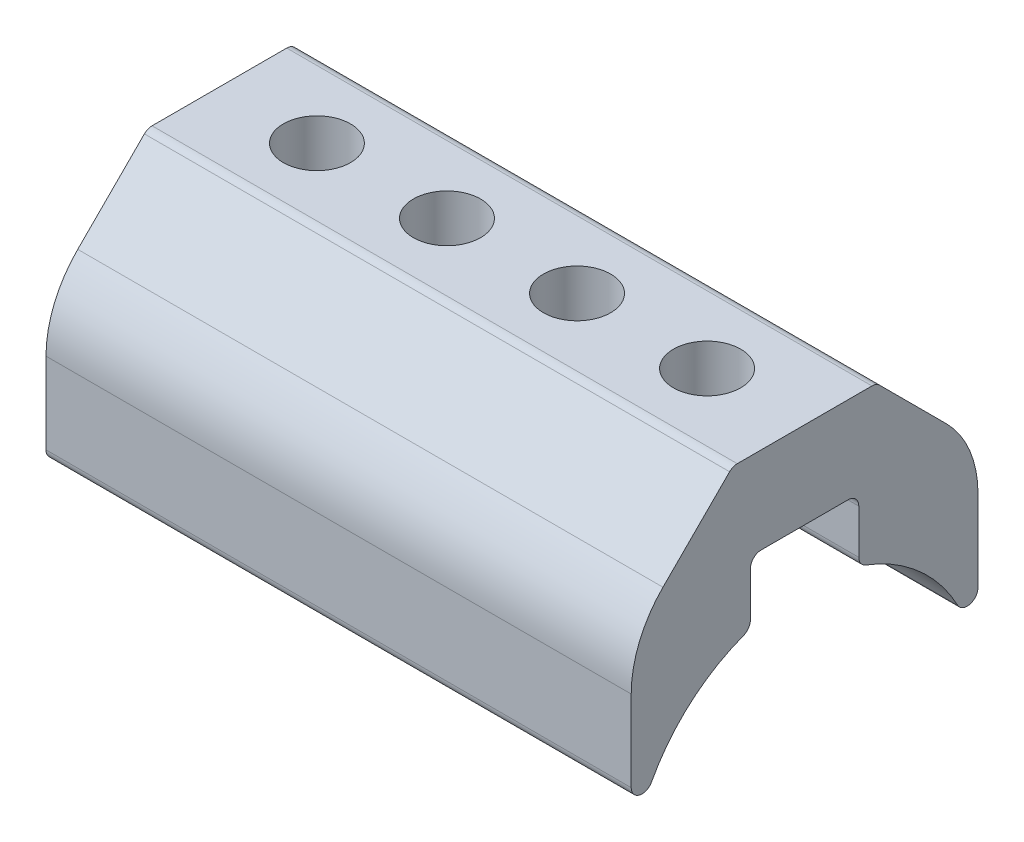
ISO-10303-21;
HEADER;
FILE_DESCRIPTION(('STEP AP214'),'2;1');
FILE_NAME('part.step','',(''),(''),'','','');
FILE_SCHEMA(('AUTOMOTIVE_DESIGN { 1 0 10303 214 1 1 1 1 }'));
ENDSEC;
DATA;
#1=APPLICATION_CONTEXT('core data for automotive mechanical design processes');
#2=APPLICATION_PROTOCOL_DEFINITION('international standard','automotive_design',2000,#1);
#3=PRODUCT_CONTEXT('',#1,'mechanical');
#4=PRODUCT('Part','Part','',(#3));
#5=PRODUCT_RELATED_PRODUCT_CATEGORY('part','',(#4));
#6=PRODUCT_DEFINITION_FORMATION('','',#4);
#7=PRODUCT_DEFINITION_CONTEXT('part definition',#1,'design');
#8=PRODUCT_DEFINITION('design','',#6,#7);
#9=PRODUCT_DEFINITION_SHAPE('','',#8);
#10=(LENGTH_UNIT() NAMED_UNIT(*) SI_UNIT(.MILLI.,.METRE.));
#11=(NAMED_UNIT(*) PLANE_ANGLE_UNIT() SI_UNIT($,.RADIAN.));
#12=(NAMED_UNIT(*) SI_UNIT($,.STERADIAN.) SOLID_ANGLE_UNIT());
#13=UNCERTAINTY_MEASURE_WITH_UNIT(LENGTH_MEASURE(1.E-05),#10,'distance_accuracy_value','');
#14=(GEOMETRIC_REPRESENTATION_CONTEXT(3) GLOBAL_UNCERTAINTY_ASSIGNED_CONTEXT((#13)) GLOBAL_UNIT_ASSIGNED_CONTEXT((#10,
#11,#12)) REPRESENTATION_CONTEXT('',''));
#15=CARTESIAN_POINT('',(0.,0.,0.));
#16=DIRECTION('',(0.,0.,1.));
#17=DIRECTION('',(1.,0.,0.));
#18=AXIS2_PLACEMENT_3D('',#15,#16,#17);
#19=CARTESIAN_POINT('',(45.,7.00000000000001,0.));
#20=DIRECTION('',(0.,1.,0.));
#21=DIRECTION('',(0.,0.,1.));
#22=AXIS2_PLACEMENT_3D('',#19,#20,#21);
#23=CYLINDRICAL_SURFACE('',#22,2.);
#24=CARTESIAN_POINT('',(45.,24.,0.));
#25=DIRECTION('',(0.,1.,0.));
#26=DIRECTION('',(0.,0.,1.));
#27=AXIS2_PLACEMENT_3D('',#24,#25,#26);
#28=CIRCLE('',#27,2.);
#29=CARTESIAN_POINT('',(45.,24.,2.));
#30=VERTEX_POINT('',#29);
#31=EDGE_CURVE('E719',#30,#30,#28,.T.);
#32=ORIENTED_EDGE('',*,*,#31,.T.);
#33=EDGE_LOOP('',(#32));
#34=FACE_BOUND('',#33,.T.);
#35=CARTESIAN_POINT('',(45.,21.,0.));
#36=DIRECTION('',(0.,-1.,0.));
#37=DIRECTION('',(0.,0.,-1.));
#38=AXIS2_PLACEMENT_3D('',#35,#36,#37);
#39=CIRCLE('',#38,2.);
#40=CARTESIAN_POINT('',(45.,21.,-2.));
#41=VERTEX_POINT('',#40);
#42=EDGE_CURVE('E684',#41,#41,#39,.F.);
#43=ORIENTED_EDGE('',*,*,#42,.F.);
#44=EDGE_LOOP('',(#43));
#45=FACE_BOUND('',#44,.T.);
#46=ADVANCED_FACE('F33',(#34,#45),#23,.F.);
#47=CARTESIAN_POINT('',(33.,7.00000000000001,0.));
#48=DIRECTION('',(0.,1.,0.));
#49=DIRECTION('',(0.,0.,1.));
#50=AXIS2_PLACEMENT_3D('',#47,#48,#49);
#51=CYLINDRICAL_SURFACE('',#50,2.);
#52=CARTESIAN_POINT('',(33.,24.,0.));
#53=DIRECTION('',(0.,1.,0.));
#54=DIRECTION('',(0.,0.,1.));
#55=AXIS2_PLACEMENT_3D('',#52,#53,#54);
#56=CIRCLE('',#55,2.);
#57=CARTESIAN_POINT('',(33.,24.,2.));
#58=VERTEX_POINT('',#57);
#59=EDGE_CURVE('E710',#58,#58,#56,.T.);
#60=ORIENTED_EDGE('',*,*,#59,.T.);
#61=EDGE_LOOP('',(#60));
#62=FACE_BOUND('',#61,.T.);
#63=CARTESIAN_POINT('',(33.,21.,0.));
#64=DIRECTION('',(0.,-1.,0.));
#65=DIRECTION('',(0.,0.,-1.));
#66=AXIS2_PLACEMENT_3D('',#63,#64,#65);
#67=CIRCLE('',#66,2.);
#68=CARTESIAN_POINT('',(33.,21.,-2.));
#69=VERTEX_POINT('',#68);
#70=EDGE_CURVE('E680',#69,#69,#67,.F.);
#71=ORIENTED_EDGE('',*,*,#70,.F.);
#72=EDGE_LOOP('',(#71));
#73=FACE_BOUND('',#72,.T.);
#74=ADVANCED_FACE('F376',(#62,#73),#51,.F.);
#75=CARTESIAN_POINT('',(21.,7.00000000000001,0.));
#76=DIRECTION('',(0.,1.,0.));
#77=DIRECTION('',(0.,0.,1.));
#78=AXIS2_PLACEMENT_3D('',#75,#76,#77);
#79=CYLINDRICAL_SURFACE('',#78,2.);
#80=CARTESIAN_POINT('',(21.,24.,0.));
#81=DIRECTION('',(0.,1.,0.));
#82=DIRECTION('',(0.,0.,1.));
#83=AXIS2_PLACEMENT_3D('',#80,#81,#82);
#84=CIRCLE('',#83,2.);
#85=CARTESIAN_POINT('',(21.,24.,2.));
#86=VERTEX_POINT('',#85);
#87=EDGE_CURVE('E675',#86,#86,#84,.T.);
#88=ORIENTED_EDGE('',*,*,#87,.T.);
#89=EDGE_LOOP('',(#88));
#90=FACE_BOUND('',#89,.T.);
#91=CARTESIAN_POINT('',(21.,21.,0.));
#92=DIRECTION('',(0.,-1.,0.));
#93=DIRECTION('',(0.,0.,-1.));
#94=AXIS2_PLACEMENT_3D('',#91,#92,#93);
#95=CIRCLE('',#94,2.);
#96=CARTESIAN_POINT('',(21.,21.,-2.));
#97=VERTEX_POINT('',#96);
#98=EDGE_CURVE('E678',#97,#97,#95,.F.);
#99=ORIENTED_EDGE('',*,*,#98,.F.);
#100=EDGE_LOOP('',(#99));
#101=FACE_BOUND('',#100,.T.);
#102=ADVANCED_FACE('F382',(#90,#101),#79,.F.);
#103=CARTESIAN_POINT('',(9.,7.00000000000001,0.));
#104=DIRECTION('',(0.,1.,0.));
#105=DIRECTION('',(0.,0.,1.));
#106=AXIS2_PLACEMENT_3D('',#103,#104,#105);
#107=CYLINDRICAL_SURFACE('',#106,2.);
#108=CARTESIAN_POINT('',(9.,24.,0.));
#109=DIRECTION('',(0.,1.,0.));
#110=DIRECTION('',(0.,0.,1.));
#111=AXIS2_PLACEMENT_3D('',#108,#109,#110);
#112=CIRCLE('',#111,2.);
#113=CARTESIAN_POINT('',(9.,24.,2.));
#114=VERTEX_POINT('',#113);
#115=EDGE_CURVE('E694',#114,#114,#112,.T.);
#116=ORIENTED_EDGE('',*,*,#115,.T.);
#117=EDGE_LOOP('',(#116));
#118=FACE_BOUND('',#117,.T.);
#119=CARTESIAN_POINT('',(9.,21.,0.));
#120=DIRECTION('',(0.,-1.,0.));
#121=DIRECTION('',(0.,0.,-1.));
#122=AXIS2_PLACEMENT_3D('',#119,#120,#121);
#123=CIRCLE('',#122,2.);
#124=CARTESIAN_POINT('',(9.,21.,-2.));
#125=VERTEX_POINT('',#124);
#126=EDGE_CURVE('E681',#125,#125,#123,.F.);
#127=ORIENTED_EDGE('',*,*,#126,.F.);
#128=EDGE_LOOP('',(#127));
#129=FACE_BOUND('',#128,.T.);
#130=ADVANCED_FACE('F638',(#118,#129),#107,.F.);
#131=CARTESIAN_POINT('',(54.,0.,0.));
#132=DIRECTION('',(-1.,0.,0.));
#133=DIRECTION('',(0.,0.,1.));
#134=AXIS2_PLACEMENT_3D('',#131,#132,#133);
#135=CYLINDRICAL_SURFACE('',#134,16.);
#136=CARTESIAN_POINT('',(54.,0.,0.));
#137=DIRECTION('',(-1.,0.,0.));
#138=DIRECTION('',(0.,0.,-1.));
#139=AXIS2_PLACEMENT_3D('',#136,#137,#138);
#140=CIRCLE('',#139,16.);
#141=CARTESIAN_POINT('',(54.,14.9703282076112,-5.64705882352941));
#142=VERTEX_POINT('',#141);
#143=CARTESIAN_POINT('',(54.,7.52941176470589,-14.1176470588235));
#144=VERTEX_POINT('',#143);
#145=EDGE_CURVE('E193',#142,#144,#140,.T.);
#146=ORIENTED_EDGE('',*,*,#145,.F.);
#147=DIRECTION('',(-1.,0.,0.));
#148=VECTOR('',#147,1.);
#149=CARTESIAN_POINT('',(54.,14.9703282076112,-5.64705882352941));
#150=LINE('',#149,#148);
#151=CARTESIAN_POINT('',(0.,14.9703282076112,-5.64705882352941));
#152=VERTEX_POINT('',#151);
#153=EDGE_CURVE('E240',#142,#152,#150,.T.);
#154=ORIENTED_EDGE('',*,*,#153,.T.);
#155=CARTESIAN_POINT('',(0.,0.,0.));
#156=DIRECTION('',(-1.,0.,0.));
#157=DIRECTION('',(0.,0.,-1.));
#158=AXIS2_PLACEMENT_3D('',#155,#156,#157);
#159=CIRCLE('',#158,16.);
#160=CARTESIAN_POINT('',(0.,7.52941176470589,-14.1176470588235));
#161=VERTEX_POINT('',#160);
#162=EDGE_CURVE('E215',#152,#161,#159,.T.);
#163=ORIENTED_EDGE('',*,*,#162,.T.);
#164=DIRECTION('',(-1.,0.,0.));
#165=VECTOR('',#164,1.);
#166=CARTESIAN_POINT('',(54.,7.52941176470589,-14.1176470588235));
#167=LINE('',#166,#165);
#168=EDGE_CURVE('E311',#144,#161,#167,.T.);
#169=ORIENTED_EDGE('',*,*,#168,.F.);
#170=EDGE_LOOP('',(#146,#154,#163,#169));
#171=FACE_BOUND('',#170,.T.);
#172=ADVANCED_FACE('F350',(#171),#135,.F.);
#173=CARTESIAN_POINT('',(54.,8.00000000000001,15.));
#174=DIRECTION('',(1.,0.,0.));
#175=DIRECTION('',(0.,0.,-1.));
#176=AXIS2_PLACEMENT_3D('',#173,#174,#175);
#177=PLANE('',#176);
#178=DIRECTION('',(0.,1.,0.));
#179=VECTOR('',#178,1.);
#180=CARTESIAN_POINT('',(54.,8.00000000000001,-16.));
#181=LINE('',#180,#179);
#182=CARTESIAN_POINT('',(54.,8.00000000000001,-16.));
#183=VERTEX_POINT('',#182);
#184=CARTESIAN_POINT('',(54.,15.4852813742386,-16.));
#185=VERTEX_POINT('',#184);
#186=EDGE_CURVE('E201',#183,#185,#181,.T.);
#187=ORIENTED_EDGE('',*,*,#186,.T.);
#188=CARTESIAN_POINT('',(54.,15.4852813742386,-5.99999999999999));
#189=DIRECTION('',(1.,0.,0.));
#190=DIRECTION('',(0.,0.,-1.));
#191=AXIS2_PLACEMENT_3D('',#188,#189,#190);
#192=CIRCLE('',#191,10.);
#193=CARTESIAN_POINT('',(54.,22.5563491861041,-13.0710678118655));
#194=VERTEX_POINT('',#193);
#195=EDGE_CURVE('E301',#185,#194,#192,.T.);
#196=ORIENTED_EDGE('',*,*,#195,.T.);
#197=DIRECTION('',(0.,0.707106781186546,0.707106781186549));
#198=VECTOR('',#197,1.);
#199=CARTESIAN_POINT('',(54.,19.6274169979696,-16.));
#200=LINE('',#199,#198);
#201=CARTESIAN_POINT('',(54.,28.7071067811865,-6.92031021678296));
#202=VERTEX_POINT('',#201);
#203=EDGE_CURVE('E318',#194,#202,#200,.T.);
#204=ORIENTED_EDGE('',*,*,#203,.T.);
#205=CARTESIAN_POINT('',(54.,28.,-6.21320343559642));
#206=DIRECTION('',(1.,0.,0.));
#207=DIRECTION('',(0.,0.,-1.));
#208=AXIS2_PLACEMENT_3D('',#205,#206,#207);
#209=CIRCLE('',#208,1.);
#210=CARTESIAN_POINT('',(54.,29.,-6.21320343559642));
#211=VERTEX_POINT('',#210);
#212=EDGE_CURVE('E254',#202,#211,#209,.T.);
#213=ORIENTED_EDGE('',*,*,#212,.T.);
#214=DIRECTION('',(0.,0.,1.));
#215=VECTOR('',#214,1.);
#216=CARTESIAN_POINT('',(54.,29.,-6.62741699796951));
#217=LINE('',#216,#215);
#218=CARTESIAN_POINT('',(54.,29.,6.21320343559642));
#219=VERTEX_POINT('',#218);
#220=EDGE_CURVE('E322',#211,#219,#217,.T.);
#221=ORIENTED_EDGE('',*,*,#220,.T.);
#222=CARTESIAN_POINT('',(54.,28.,6.21320343559642));
#223=DIRECTION('',(1.,0.,0.));
#224=DIRECTION('',(0.,0.,-1.));
#225=AXIS2_PLACEMENT_3D('',#222,#223,#224);
#226=CIRCLE('',#225,1.);
#227=CARTESIAN_POINT('',(54.,28.7071067811865,6.92031021678296));
#228=VERTEX_POINT('',#227);
#229=EDGE_CURVE('E252',#219,#228,#226,.T.);
#230=ORIENTED_EDGE('',*,*,#229,.T.);
#231=DIRECTION('',(0.,-0.707106781186546,0.707106781186549));
#232=VECTOR('',#231,1.);
#233=CARTESIAN_POINT('',(54.,19.6274169979696,16.));
#234=LINE('',#233,#232);
#235=CARTESIAN_POINT('',(54.,22.5563491861041,13.0710678118655));
#236=VERTEX_POINT('',#235);
#237=EDGE_CURVE('E178',#228,#236,#234,.T.);
#238=ORIENTED_EDGE('',*,*,#237,.T.);
#239=CARTESIAN_POINT('',(54.,15.4852813742386,5.99999999999999));
#240=DIRECTION('',(1.,0.,0.));
#241=DIRECTION('',(0.,0.,-1.));
#242=AXIS2_PLACEMENT_3D('',#239,#240,#241);
#243=CIRCLE('',#242,10.);
#244=CARTESIAN_POINT('',(54.,15.4852813742386,16.));
#245=VERTEX_POINT('',#244);
#246=EDGE_CURVE('E48',#236,#245,#243,.T.);
#247=ORIENTED_EDGE('',*,*,#246,.T.);
#248=DIRECTION('',(0.,-1.,0.));
#249=VECTOR('',#248,1.);
#250=CARTESIAN_POINT('',(54.,8.00000000000001,16.));
#251=LINE('',#250,#249);
#252=CARTESIAN_POINT('',(54.,8.00000000000001,16.));
#253=VERTEX_POINT('',#252);
#254=EDGE_CURVE('E167',#245,#253,#251,.T.);
#255=ORIENTED_EDGE('',*,*,#254,.T.);
#256=CARTESIAN_POINT('',(54.,8.00000000000001,15.));
#257=DIRECTION('',(1.,0.,0.));
#258=DIRECTION('',(0.,0.,-1.));
#259=AXIS2_PLACEMENT_3D('',#256,#257,#258);
#260=CIRCLE('',#259,1.);
#261=CARTESIAN_POINT('',(54.,7.52941176470589,14.1176470588235));
#262=VERTEX_POINT('',#261);
#263=EDGE_CURVE('E173',#253,#262,#260,.T.);
#264=ORIENTED_EDGE('',*,*,#263,.T.);
#265=CARTESIAN_POINT('',(54.,14.9703282076112,5.64705882352942));
#266=VERTEX_POINT('',#265);
#267=EDGE_CURVE('E195',#262,#266,#140,.T.);
#268=ORIENTED_EDGE('',*,*,#267,.T.);
#269=CARTESIAN_POINT('',(54.,15.9059737205869,6.));
#270=DIRECTION('',(1.,0.,0.));
#271=DIRECTION('',(0.,0.,-1.));
#272=AXIS2_PLACEMENT_3D('',#269,#270,#271);
#273=CIRCLE('',#272,1.);
#274=CARTESIAN_POINT('',(54.,15.9059737205869,5.));
#275=VERTEX_POINT('',#274);
#276=EDGE_CURVE('E256',#266,#275,#273,.T.);
#277=ORIENTED_EDGE('',*,*,#276,.T.);
#278=DIRECTION('',(0.,1.,0.));
#279=VECTOR('',#278,1.);
#280=CARTESIAN_POINT('',(54.,0.,5.));
#281=LINE('',#280,#279);
#282=CARTESIAN_POINT('',(54.,20.,5.));
#283=VERTEX_POINT('',#282);
#284=EDGE_CURVE('E776',#275,#283,#281,.T.);
#285=ORIENTED_EDGE('',*,*,#284,.T.);
#286=CARTESIAN_POINT('',(54.,20.,4.));
#287=DIRECTION('',(1.,0.,0.));
#288=DIRECTION('',(0.,0.,-1.));
#289=AXIS2_PLACEMENT_3D('',#286,#287,#288);
#290=CIRCLE('',#289,1.);
#291=CARTESIAN_POINT('',(54.,21.,4.));
#292=VERTEX_POINT('',#291);
#293=EDGE_CURVE('E289',#283,#292,#290,.F.);
#294=ORIENTED_EDGE('',*,*,#293,.T.);
#295=DIRECTION('',(0.,0.,1.));
#296=VECTOR('',#295,1.);
#297=CARTESIAN_POINT('',(54.,21.,0.));
#298=LINE('',#297,#296);
#299=CARTESIAN_POINT('',(54.,21.,-4.));
#300=VERTEX_POINT('',#299);
#301=EDGE_CURVE('E773',#300,#292,#298,.T.);
#302=ORIENTED_EDGE('',*,*,#301,.F.);
#303=CARTESIAN_POINT('',(54.,20.,-4.));
#304=DIRECTION('',(1.,0.,0.));
#305=DIRECTION('',(0.,0.,-1.));
#306=AXIS2_PLACEMENT_3D('',#303,#304,#305);
#307=CIRCLE('',#306,1.);
#308=CARTESIAN_POINT('',(54.,20.,-5.));
#309=VERTEX_POINT('',#308);
#310=EDGE_CURVE('E285',#300,#309,#307,.F.);
#311=ORIENTED_EDGE('',*,*,#310,.T.);
#312=DIRECTION('',(0.,1.,0.));
#313=VECTOR('',#312,1.);
#314=CARTESIAN_POINT('',(54.,0.,-5.));
#315=LINE('',#314,#313);
#316=CARTESIAN_POINT('',(54.,15.9059737205869,-5.));
#317=VERTEX_POINT('',#316);
#318=EDGE_CURVE('E687',#317,#309,#315,.T.);
#319=ORIENTED_EDGE('',*,*,#318,.F.);
#320=CARTESIAN_POINT('',(54.,15.9059737205869,-6.));
#321=DIRECTION('',(1.,0.,0.));
#322=DIRECTION('',(0.,0.,-1.));
#323=AXIS2_PLACEMENT_3D('',#320,#321,#322);
#324=CIRCLE('',#323,1.);
#325=EDGE_CURVE('E258',#317,#142,#324,.T.);
#326=ORIENTED_EDGE('',*,*,#325,.T.);
#327=ORIENTED_EDGE('',*,*,#145,.T.);
#328=CARTESIAN_POINT('',(54.,8.00000000000001,-15.));
#329=DIRECTION('',(1.,0.,0.));
#330=DIRECTION('',(0.,0.,1.));
#331=AXIS2_PLACEMENT_3D('',#328,#329,#330);
#332=CIRCLE('',#331,1.);
#333=EDGE_CURVE('E199',#144,#183,#332,.T.);
#334=ORIENTED_EDGE('',*,*,#333,.T.);
#335=EDGE_LOOP('',(#187,#196,#204,#213,#221,#230,#238,#247,#255,#264,#268,#277,#285,#294,#302,
#311,#319,#326,#327,#334));
#336=FACE_BOUND('',#335,.T.);
#337=ADVANCED_FACE('F170',(#336),#177,.T.);
#338=CARTESIAN_POINT('',(0.,8.00000000000001,15.));
#339=DIRECTION('',(1.,0.,0.));
#340=DIRECTION('',(0.,0.,-1.));
#341=AXIS2_PLACEMENT_3D('',#338,#339,#340);
#342=PLANE('',#341);
#343=DIRECTION('',(0.,0.707106781186546,0.707106781186549));
#344=VECTOR('',#343,1.);
#345=CARTESIAN_POINT('',(0.,19.6274169979696,-16.));
#346=LINE('',#345,#344);
#347=CARTESIAN_POINT('',(0.,22.5563491861041,-13.0710678118655));
#348=VERTEX_POINT('',#347);
#349=CARTESIAN_POINT('',(0.,28.7071067811865,-6.92031021678296));
#350=VERTEX_POINT('',#349);
#351=EDGE_CURVE('E204',#348,#350,#346,.T.);
#352=ORIENTED_EDGE('',*,*,#351,.F.);
#353=CARTESIAN_POINT('',(0.,15.4852813742386,-5.99999999999999));
#354=DIRECTION('',(1.,0.,0.));
#355=DIRECTION('',(0.,0.,-1.));
#356=AXIS2_PLACEMENT_3D('',#353,#354,#355);
#357=CIRCLE('',#356,10.);
#358=CARTESIAN_POINT('',(0.,15.4852813742386,-16.));
#359=VERTEX_POINT('',#358);
#360=EDGE_CURVE('E296',#348,#359,#357,.F.);
#361=ORIENTED_EDGE('',*,*,#360,.T.);
#362=DIRECTION('',(0.,1.,0.));
#363=VECTOR('',#362,1.);
#364=CARTESIAN_POINT('',(0.,8.00000000000001,-16.));
#365=LINE('',#364,#363);
#366=CARTESIAN_POINT('',(0.,8.00000000000001,-16.));
#367=VERTEX_POINT('',#366);
#368=EDGE_CURVE('E316',#367,#359,#365,.T.);
#369=ORIENTED_EDGE('',*,*,#368,.F.);
#370=CARTESIAN_POINT('',(0.,8.00000000000001,-15.));
#371=DIRECTION('',(1.,0.,0.));
#372=DIRECTION('',(0.,0.,1.));
#373=AXIS2_PLACEMENT_3D('',#370,#371,#372);
#374=CIRCLE('',#373,1.);
#375=EDGE_CURVE('E218',#161,#367,#374,.T.);
#376=ORIENTED_EDGE('',*,*,#375,.F.);
#377=ORIENTED_EDGE('',*,*,#162,.F.);
#378=CARTESIAN_POINT('',(0.,15.9059737205869,-6.));
#379=DIRECTION('',(1.,0.,0.));
#380=DIRECTION('',(0.,0.,-1.));
#381=AXIS2_PLACEMENT_3D('',#378,#379,#380);
#382=CIRCLE('',#381,1.);
#383=CARTESIAN_POINT('',(0.,15.9059737205869,-5.));
#384=VERTEX_POINT('',#383);
#385=EDGE_CURVE('E245',#152,#384,#382,.F.);
#386=ORIENTED_EDGE('',*,*,#385,.T.);
#387=DIRECTION('',(0.,-1.,0.));
#388=VECTOR('',#387,1.);
#389=CARTESIAN_POINT('',(0.,8.00000000000001,-5.));
#390=LINE('',#389,#388);
#391=CARTESIAN_POINT('',(0.,20.,-5.));
#392=VERTEX_POINT('',#391);
#393=EDGE_CURVE('E236',#392,#384,#390,.T.);
#394=ORIENTED_EDGE('',*,*,#393,.F.);
#395=CARTESIAN_POINT('',(0.,20.,-4.));
#396=DIRECTION('',(1.,0.,0.));
#397=DIRECTION('',(0.,0.,-1.));
#398=AXIS2_PLACEMENT_3D('',#395,#396,#397);
#399=CIRCLE('',#398,1.);
#400=CARTESIAN_POINT('',(0.,21.,-4.));
#401=VERTEX_POINT('',#400);
#402=EDGE_CURVE('E283',#392,#401,#399,.T.);
#403=ORIENTED_EDGE('',*,*,#402,.T.);
#404=DIRECTION('',(0.,0.,-1.));
#405=VECTOR('',#404,1.);
#406=CARTESIAN_POINT('',(0.,21.,15.));
#407=LINE('',#406,#405);
#408=CARTESIAN_POINT('',(0.,21.,4.));
#409=VERTEX_POINT('',#408);
#410=EDGE_CURVE('E231',#409,#401,#407,.T.);
#411=ORIENTED_EDGE('',*,*,#410,.F.);
#412=CARTESIAN_POINT('',(0.,20.,4.));
#413=DIRECTION('',(1.,0.,0.));
#414=DIRECTION('',(0.,0.,-1.));
#415=AXIS2_PLACEMENT_3D('',#412,#413,#414);
#416=CIRCLE('',#415,1.);
#417=CARTESIAN_POINT('',(0.,20.,5.));
#418=VERTEX_POINT('',#417);
#419=EDGE_CURVE('E287',#409,#418,#416,.T.);
#420=ORIENTED_EDGE('',*,*,#419,.T.);
#421=DIRECTION('',(0.,-1.,0.));
#422=VECTOR('',#421,1.);
#423=CARTESIAN_POINT('',(0.,8.00000000000001,5.));
#424=LINE('',#423,#422);
#425=CARTESIAN_POINT('',(0.,15.9059737205869,5.));
#426=VERTEX_POINT('',#425);
#427=EDGE_CURVE('E187',#418,#426,#424,.T.);
#428=ORIENTED_EDGE('',*,*,#427,.T.);
#429=CARTESIAN_POINT('',(0.,15.9059737205869,6.));
#430=DIRECTION('',(1.,0.,0.));
#431=DIRECTION('',(0.,0.,-1.));
#432=AXIS2_PLACEMENT_3D('',#429,#430,#431);
#433=CIRCLE('',#432,1.);
#434=CARTESIAN_POINT('',(0.,14.9703282076112,5.64705882352942));
#435=VERTEX_POINT('',#434);
#436=EDGE_CURVE('E243',#426,#435,#433,.F.);
#437=ORIENTED_EDGE('',*,*,#436,.T.);
#438=CARTESIAN_POINT('',(0.,7.52941176470589,14.1176470588235));
#439=VERTEX_POINT('',#438);
#440=EDGE_CURVE('E225',#439,#435,#159,.T.);
#441=ORIENTED_EDGE('',*,*,#440,.F.);
#442=CARTESIAN_POINT('',(0.,8.00000000000001,15.));
#443=DIRECTION('',(1.,0.,0.));
#444=DIRECTION('',(0.,0.,-1.));
#445=AXIS2_PLACEMENT_3D('',#442,#443,#444);
#446=CIRCLE('',#445,1.);
#447=CARTESIAN_POINT('',(0.,8.00000000000001,16.));
#448=VERTEX_POINT('',#447);
#449=EDGE_CURVE('E213',#448,#439,#446,.T.);
#450=ORIENTED_EDGE('',*,*,#449,.F.);
#451=DIRECTION('',(0.,-1.,0.));
#452=VECTOR('',#451,1.);
#453=CARTESIAN_POINT('',(0.,8.00000000000001,16.));
#454=LINE('',#453,#452);
#455=CARTESIAN_POINT('',(0.,15.4852813742386,16.));
#456=VERTEX_POINT('',#455);
#457=EDGE_CURVE('E184',#456,#448,#454,.T.);
#458=ORIENTED_EDGE('',*,*,#457,.F.);
#459=CARTESIAN_POINT('',(0.,15.4852813742386,5.99999999999999));
#460=DIRECTION('',(1.,0.,0.));
#461=DIRECTION('',(0.,0.,-1.));
#462=AXIS2_PLACEMENT_3D('',#459,#460,#461);
#463=CIRCLE('',#462,10.);
#464=CARTESIAN_POINT('',(0.,22.5563491861041,13.0710678118655));
#465=VERTEX_POINT('',#464);
#466=EDGE_CURVE('E294',#456,#465,#463,.F.);
#467=ORIENTED_EDGE('',*,*,#466,.T.);
#468=DIRECTION('',(0.,-0.707106781186546,0.707106781186549));
#469=VECTOR('',#468,1.);
#470=CARTESIAN_POINT('',(0.,19.6274169979696,16.));
#471=LINE('',#470,#469);
#472=CARTESIAN_POINT('',(0.,28.7071067811865,6.92031021678296));
#473=VERTEX_POINT('',#472);
#474=EDGE_CURVE('E210',#473,#465,#471,.T.);
#475=ORIENTED_EDGE('',*,*,#474,.F.);
#476=CARTESIAN_POINT('',(0.,28.,6.21320343559642));
#477=DIRECTION('',(1.,0.,0.));
#478=DIRECTION('',(0.,0.,-1.));
#479=AXIS2_PLACEMENT_3D('',#476,#477,#478);
#480=CIRCLE('',#479,1.);
#481=CARTESIAN_POINT('',(0.,29.,6.21320343559642));
#482=VERTEX_POINT('',#481);
#483=EDGE_CURVE('E237',#473,#482,#480,.F.);
#484=ORIENTED_EDGE('',*,*,#483,.T.);
#485=DIRECTION('',(0.,0.,1.));
#486=VECTOR('',#485,1.);
#487=CARTESIAN_POINT('',(0.,29.,-6.62741699796951));
#488=LINE('',#487,#486);
#489=CARTESIAN_POINT('',(0.,29.,-6.21320343559642));
#490=VERTEX_POINT('',#489);
#491=EDGE_CURVE('E206',#490,#482,#488,.T.);
#492=ORIENTED_EDGE('',*,*,#491,.F.);
#493=CARTESIAN_POINT('',(0.,28.,-6.21320343559642));
#494=DIRECTION('',(1.,0.,0.));
#495=DIRECTION('',(0.,0.,-1.));
#496=AXIS2_PLACEMENT_3D('',#493,#494,#495);
#497=CIRCLE('',#496,1.);
#498=EDGE_CURVE('E239',#490,#350,#497,.F.);
#499=ORIENTED_EDGE('',*,*,#498,.T.);
#500=EDGE_LOOP('',(#352,#361,#369,#376,#377,#386,#394,#403,#411,#420,#428,#437,#441,#450,#458,
#467,#475,#484,#492,#499));
#501=FACE_BOUND('',#500,.T.);
#502=ADVANCED_FACE('F305',(#501),#342,.F.);
#503=CARTESIAN_POINT('',(54.,19.6274169979696,-16.));
#504=DIRECTION('',(0.,-0.707106781186549,0.707106781186546));
#505=DIRECTION('',(0.,-0.707106781186546,-0.707106781186549));
#506=AXIS2_PLACEMENT_3D('',#503,#504,#505);
#507=PLANE('',#506);
#508=ORIENTED_EDGE('',*,*,#203,.F.);
#509=DIRECTION('',(-1.,0.,0.));
#510=VECTOR('',#509,1.);
#511=CARTESIAN_POINT('',(54.,22.5563491861041,-13.0710678118655));
#512=LINE('',#511,#510);
#513=EDGE_CURVE('E291',#194,#348,#512,.T.);
#514=ORIENTED_EDGE('',*,*,#513,.T.);
#515=ORIENTED_EDGE('',*,*,#351,.T.);
#516=DIRECTION('',(-1.,0.,0.));
#517=VECTOR('',#516,1.);
#518=CARTESIAN_POINT('',(54.,28.7071067811865,-6.92031021678297));
#519=LINE('',#518,#517);
#520=EDGE_CURVE('E277',#350,#202,#519,.F.);
#521=ORIENTED_EDGE('',*,*,#520,.T.);
#522=EDGE_LOOP('',(#508,#514,#515,#521));
#523=FACE_BOUND('',#522,.T.);
#524=ADVANCED_FACE('F339',(#523),#507,.F.);
#525=CARTESIAN_POINT('',(54.,29.,-6.62741699796951));
#526=DIRECTION('',(0.,-1.,0.));
#527=DIRECTION('',(0.,0.,-1.));
#528=AXIS2_PLACEMENT_3D('',#525,#526,#527);
#529=PLANE('',#528);
#530=CARTESIAN_POINT('',(9.,29.,0.));
#531=DIRECTION('',(0.,1.,0.));
#532=DIRECTION('',(0.,0.,1.));
#533=AXIS2_PLACEMENT_3D('',#530,#531,#532);
#534=CIRCLE('',#533,3.1);
#535=CARTESIAN_POINT('',(9.,29.,3.1));
#536=VERTEX_POINT('',#535);
#537=EDGE_CURVE('E697',#536,#536,#534,.T.);
#538=ORIENTED_EDGE('',*,*,#537,.F.);
#539=EDGE_LOOP('',(#538));
#540=FACE_BOUND('',#539,.T.);
#541=CARTESIAN_POINT('',(21.,29.,0.));
#542=DIRECTION('',(0.,1.,0.));
#543=DIRECTION('',(0.,0.,1.));
#544=AXIS2_PLACEMENT_3D('',#541,#542,#543);
#545=CIRCLE('',#544,3.1);
#546=CARTESIAN_POINT('',(21.,29.,3.1));
#547=VERTEX_POINT('',#546);
#548=EDGE_CURVE('E704',#547,#547,#545,.T.);
#549=ORIENTED_EDGE('',*,*,#548,.F.);
#550=EDGE_LOOP('',(#549));
#551=FACE_BOUND('',#550,.T.);
#552=CARTESIAN_POINT('',(33.,29.,0.));
#553=DIRECTION('',(0.,1.,0.));
#554=DIRECTION('',(0.,0.,1.));
#555=AXIS2_PLACEMENT_3D('',#552,#553,#554);
#556=CIRCLE('',#555,3.1);
#557=CARTESIAN_POINT('',(33.,29.,3.1));
#558=VERTEX_POINT('',#557);
#559=EDGE_CURVE('E713',#558,#558,#556,.T.);
#560=ORIENTED_EDGE('',*,*,#559,.F.);
#561=EDGE_LOOP('',(#560));
#562=FACE_BOUND('',#561,.T.);
#563=CARTESIAN_POINT('',(45.,29.,0.));
#564=DIRECTION('',(0.,1.,0.));
#565=DIRECTION('',(0.,0.,1.));
#566=AXIS2_PLACEMENT_3D('',#563,#564,#565);
#567=CIRCLE('',#566,3.09999999999999);
#568=CARTESIAN_POINT('',(45.,29.,3.09999999999999));
#569=VERTEX_POINT('',#568);
#570=EDGE_CURVE('E693',#569,#569,#567,.T.);
#571=ORIENTED_EDGE('',*,*,#570,.F.);
#572=EDGE_LOOP('',(#571));
#573=FACE_BOUND('',#572,.T.);
#574=ORIENTED_EDGE('',*,*,#220,.F.);
#575=DIRECTION('',(-1.,0.,0.));
#576=VECTOR('',#575,1.);
#577=CARTESIAN_POINT('',(54.,29.,-6.21320343559642));
#578=LINE('',#577,#576);
#579=EDGE_CURVE('E274',#211,#490,#578,.T.);
#580=ORIENTED_EDGE('',*,*,#579,.T.);
#581=ORIENTED_EDGE('',*,*,#491,.T.);
#582=DIRECTION('',(-1.,0.,0.));
#583=VECTOR('',#582,1.);
#584=CARTESIAN_POINT('',(54.,29.,6.21320343559642));
#585=LINE('',#584,#583);
#586=EDGE_CURVE('E272',#482,#219,#585,.F.);
#587=ORIENTED_EDGE('',*,*,#586,.T.);
#588=EDGE_LOOP('',(#574,#580,#581,#587));
#589=FACE_BOUND('',#588,.T.);
#590=ADVANCED_FACE('F407',(#540,#551,#562,#573,#589),#529,.F.);
#591=CARTESIAN_POINT('',(54.,19.6274169979696,16.));
#592=DIRECTION('',(0.,-0.707106781186549,-0.707106781186546));
#593=DIRECTION('',(0.,0.707106781186546,-0.707106781186549));
#594=AXIS2_PLACEMENT_3D('',#591,#592,#593);
#595=PLANE('',#594);
#596=ORIENTED_EDGE('',*,*,#474,.T.);
#597=DIRECTION('',(-1.,0.,0.));
#598=VECTOR('',#597,1.);
#599=CARTESIAN_POINT('',(54.,22.5563491861041,13.0710678118655));
#600=LINE('',#599,#598);
#601=EDGE_CURVE('E11',#465,#236,#600,.F.);
#602=ORIENTED_EDGE('',*,*,#601,.T.);
#603=ORIENTED_EDGE('',*,*,#237,.F.);
#604=DIRECTION('',(-1.,0.,0.));
#605=VECTOR('',#604,1.);
#606=CARTESIAN_POINT('',(54.,28.7071067811865,6.92031021678296));
#607=LINE('',#606,#605);
#608=EDGE_CURVE('E280',#228,#473,#607,.T.);
#609=ORIENTED_EDGE('',*,*,#608,.T.);
#610=EDGE_LOOP('',(#596,#602,#603,#609));
#611=FACE_BOUND('',#610,.T.);
#612=ADVANCED_FACE('F404',(#611),#595,.F.);
#613=CARTESIAN_POINT('',(54.,8.00000000000001,16.));
#614=DIRECTION('',(0.,0.,-1.));
#615=DIRECTION('',(0.,1.,0.));
#616=AXIS2_PLACEMENT_3D('',#613,#614,#615);
#617=PLANE('',#616);
#618=ORIENTED_EDGE('',*,*,#254,.F.);
#619=DIRECTION('',(-1.,0.,0.));
#620=VECTOR('',#619,1.);
#621=CARTESIAN_POINT('',(54.,15.4852813742386,16.));
#622=LINE('',#621,#620);
#623=EDGE_CURVE('E41',#245,#456,#622,.T.);
#624=ORIENTED_EDGE('',*,*,#623,.T.);
#625=ORIENTED_EDGE('',*,*,#457,.T.);
#626=DIRECTION('',(-1.,0.,0.));
#627=VECTOR('',#626,1.);
#628=CARTESIAN_POINT('',(54.,8.00000000000001,16.));
#629=LINE('',#628,#627);
#630=EDGE_CURVE('E181',#253,#448,#629,.T.);
#631=ORIENTED_EDGE('',*,*,#630,.F.);
#632=EDGE_LOOP('',(#618,#624,#625,#631));
#633=FACE_BOUND('',#632,.T.);
#634=ADVANCED_FACE('F182',(#633),#617,.F.);
#635=CARTESIAN_POINT('',(54.,8.00000000000001,15.));
#636=DIRECTION('',(-1.,0.,0.));
#637=DIRECTION('',(0.,0.,1.));
#638=AXIS2_PLACEMENT_3D('',#635,#636,#637);
#639=CYLINDRICAL_SURFACE('',#638,1.);
#640=ORIENTED_EDGE('',*,*,#449,.T.);
#641=DIRECTION('',(-1.,0.,0.));
#642=VECTOR('',#641,1.);
#643=CARTESIAN_POINT('',(54.,7.52941176470589,14.1176470588235));
#644=LINE('',#643,#642);
#645=EDGE_CURVE('E188',#262,#439,#644,.T.);
#646=ORIENTED_EDGE('',*,*,#645,.F.);
#647=ORIENTED_EDGE('',*,*,#263,.F.);
#648=ORIENTED_EDGE('',*,*,#630,.T.);
#649=EDGE_LOOP('',(#640,#646,#647,#648));
#650=FACE_BOUND('',#649,.T.);
#651=ADVANCED_FACE('F190',(#650),#639,.T.);
#652=ORIENTED_EDGE('',*,*,#440,.T.);
#653=DIRECTION('',(-1.,0.,0.));
#654=VECTOR('',#653,1.);
#655=CARTESIAN_POINT('',(54.,14.9703282076112,5.64705882352942));
#656=LINE('',#655,#654);
#657=EDGE_CURVE('E270',#435,#266,#656,.F.);
#658=ORIENTED_EDGE('',*,*,#657,.T.);
#659=ORIENTED_EDGE('',*,*,#267,.F.);
#660=ORIENTED_EDGE('',*,*,#645,.T.);
#661=EDGE_LOOP('',(#652,#658,#659,#660));
#662=FACE_BOUND('',#661,.T.);
#663=ADVANCED_FACE('F309',(#662),#135,.F.);
#664=CARTESIAN_POINT('',(54.,8.00000000000001,-15.));
#665=DIRECTION('',(-1.,0.,0.));
#666=DIRECTION('',(0.,0.,1.));
#667=AXIS2_PLACEMENT_3D('',#664,#665,#666);
#668=CYLINDRICAL_SURFACE('',#667,1.);
#669=ORIENTED_EDGE('',*,*,#375,.T.);
#670=DIRECTION('',(-1.,0.,0.));
#671=VECTOR('',#670,1.);
#672=CARTESIAN_POINT('',(54.,8.00000000000001,-16.));
#673=LINE('',#672,#671);
#674=EDGE_CURVE('E203',#183,#367,#673,.T.);
#675=ORIENTED_EDGE('',*,*,#674,.F.);
#676=ORIENTED_EDGE('',*,*,#333,.F.);
#677=ORIENTED_EDGE('',*,*,#168,.T.);
#678=EDGE_LOOP('',(#669,#675,#676,#677));
#679=FACE_BOUND('',#678,.T.);
#680=ADVANCED_FACE('F327',(#679),#668,.T.);
#681=CARTESIAN_POINT('',(54.,8.00000000000001,-16.));
#682=DIRECTION('',(0.,0.,1.));
#683=DIRECTION('',(0.,-1.,0.));
#684=AXIS2_PLACEMENT_3D('',#681,#682,#683);
#685=PLANE('',#684);
#686=ORIENTED_EDGE('',*,*,#368,.T.);
#687=DIRECTION('',(-1.,0.,0.));
#688=VECTOR('',#687,1.);
#689=CARTESIAN_POINT('',(54.,15.4852813742386,-16.));
#690=LINE('',#689,#688);
#691=EDGE_CURVE('E298',#359,#185,#690,.F.);
#692=ORIENTED_EDGE('',*,*,#691,.T.);
#693=ORIENTED_EDGE('',*,*,#186,.F.);
#694=ORIENTED_EDGE('',*,*,#674,.T.);
#695=EDGE_LOOP('',(#686,#692,#693,#694));
#696=FACE_BOUND('',#695,.T.);
#697=ADVANCED_FACE('F332',(#696),#685,.F.);
#698=CARTESIAN_POINT('',(9.,24.,0.));
#699=DIRECTION('',(0.,1.,0.));
#700=DIRECTION('',(0.,0.,1.));
#701=AXIS2_PLACEMENT_3D('',#698,#699,#700);
#702=CYLINDRICAL_SURFACE('',#701,3.1);
#703=CARTESIAN_POINT('',(9.,24.,0.));
#704=DIRECTION('',(0.,1.,0.));
#705=DIRECTION('',(0.,0.,1.));
#706=AXIS2_PLACEMENT_3D('',#703,#704,#705);
#707=CIRCLE('',#706,3.1);
#708=CARTESIAN_POINT('',(9.,24.,3.1));
#709=VERTEX_POINT('',#708);
#710=EDGE_CURVE('E207',#709,#709,#707,.T.);
#711=ORIENTED_EDGE('',*,*,#710,.F.);
#712=EDGE_LOOP('',(#711));
#713=FACE_BOUND('',#712,.T.);
#714=ORIENTED_EDGE('',*,*,#537,.T.);
#715=EDGE_LOOP('',(#714));
#716=FACE_BOUND('',#715,.T.);
#717=ADVANCED_FACE('F395',(#713,#716),#702,.F.);
#718=CARTESIAN_POINT('',(0.,24.,0.));
#719=DIRECTION('',(0.,1.,0.));
#720=DIRECTION('',(0.,0.,1.));
#721=AXIS2_PLACEMENT_3D('',#718,#719,#720);
#722=PLANE('',#721);
#723=ORIENTED_EDGE('',*,*,#115,.F.);
#724=EDGE_LOOP('',(#723));
#725=FACE_BOUND('',#724,.T.);
#726=ORIENTED_EDGE('',*,*,#710,.T.);
#727=EDGE_LOOP('',(#726));
#728=FACE_BOUND('',#727,.T.);
#729=ADVANCED_FACE('F452',(#725,#728),#722,.T.);
#730=CARTESIAN_POINT('',(21.,24.,0.));
#731=DIRECTION('',(0.,1.,0.));
#732=DIRECTION('',(0.,0.,1.));
#733=AXIS2_PLACEMENT_3D('',#730,#731,#732);
#734=CYLINDRICAL_SURFACE('',#733,3.1);
#735=CARTESIAN_POINT('',(21.,24.,0.));
#736=DIRECTION('',(0.,1.,0.));
#737=DIRECTION('',(0.,0.,1.));
#738=AXIS2_PLACEMENT_3D('',#735,#736,#737);
#739=CIRCLE('',#738,3.1);
#740=CARTESIAN_POINT('',(21.,24.,3.1));
#741=VERTEX_POINT('',#740);
#742=EDGE_CURVE('E702',#741,#741,#739,.T.);
#743=ORIENTED_EDGE('',*,*,#742,.F.);
#744=EDGE_LOOP('',(#743));
#745=FACE_BOUND('',#744,.T.);
#746=ORIENTED_EDGE('',*,*,#548,.T.);
#747=EDGE_LOOP('',(#746));
#748=FACE_BOUND('',#747,.T.);
#749=ADVANCED_FACE('F460',(#745,#748),#734,.F.);
#750=CARTESIAN_POINT('',(0.,24.,0.));
#751=DIRECTION('',(0.,1.,0.));
#752=DIRECTION('',(0.,0.,1.));
#753=AXIS2_PLACEMENT_3D('',#750,#751,#752);
#754=PLANE('',#753);
#755=ORIENTED_EDGE('',*,*,#87,.F.);
#756=EDGE_LOOP('',(#755));
#757=FACE_BOUND('',#756,.T.);
#758=ORIENTED_EDGE('',*,*,#742,.T.);
#759=EDGE_LOOP('',(#758));
#760=FACE_BOUND('',#759,.T.);
#761=ADVANCED_FACE('F468',(#757,#760),#754,.T.);
#762=CARTESIAN_POINT('',(33.,24.,0.));
#763=DIRECTION('',(0.,1.,0.));
#764=DIRECTION('',(0.,0.,1.));
#765=AXIS2_PLACEMENT_3D('',#762,#763,#764);
#766=CYLINDRICAL_SURFACE('',#765,3.1);
#767=CARTESIAN_POINT('',(33.,24.,0.));
#768=DIRECTION('',(0.,1.,0.));
#769=DIRECTION('',(0.,0.,1.));
#770=AXIS2_PLACEMENT_3D('',#767,#768,#769);
#771=CIRCLE('',#770,3.1);
#772=CARTESIAN_POINT('',(33.,24.,3.1));
#773=VERTEX_POINT('',#772);
#774=EDGE_CURVE('E709',#773,#773,#771,.T.);
#775=ORIENTED_EDGE('',*,*,#774,.F.);
#776=EDGE_LOOP('',(#775));
#777=FACE_BOUND('',#776,.T.);
#778=ORIENTED_EDGE('',*,*,#559,.T.);
#779=EDGE_LOOP('',(#778));
#780=FACE_BOUND('',#779,.T.);
#781=ADVANCED_FACE('F476',(#777,#780),#766,.F.);
#782=CARTESIAN_POINT('',(0.,24.,0.));
#783=DIRECTION('',(0.,1.,0.));
#784=DIRECTION('',(0.,0.,1.));
#785=AXIS2_PLACEMENT_3D('',#782,#783,#784);
#786=PLANE('',#785);
#787=ORIENTED_EDGE('',*,*,#59,.F.);
#788=EDGE_LOOP('',(#787));
#789=FACE_BOUND('',#788,.T.);
#790=ORIENTED_EDGE('',*,*,#774,.T.);
#791=EDGE_LOOP('',(#790));
#792=FACE_BOUND('',#791,.T.);
#793=ADVANCED_FACE('F484',(#789,#792),#786,.T.);
#794=CARTESIAN_POINT('',(45.,24.,0.));
#795=DIRECTION('',(0.,1.,0.));
#796=DIRECTION('',(0.,0.,1.));
#797=AXIS2_PLACEMENT_3D('',#794,#795,#796);
#798=CYLINDRICAL_SURFACE('',#797,3.09999999999999);
#799=CARTESIAN_POINT('',(45.,24.,0.));
#800=DIRECTION('',(0.,1.,0.));
#801=DIRECTION('',(0.,0.,1.));
#802=AXIS2_PLACEMENT_3D('',#799,#800,#801);
#803=CIRCLE('',#802,3.09999999999999);
#804=CARTESIAN_POINT('',(45.,24.,3.09999999999999));
#805=VERTEX_POINT('',#804);
#806=EDGE_CURVE('E718',#805,#805,#803,.T.);
#807=ORIENTED_EDGE('',*,*,#806,.F.);
#808=EDGE_LOOP('',(#807));
#809=FACE_BOUND('',#808,.T.);
#810=ORIENTED_EDGE('',*,*,#570,.T.);
#811=EDGE_LOOP('',(#810));
#812=FACE_BOUND('',#811,.T.);
#813=ADVANCED_FACE('F492',(#809,#812),#798,.F.);
#814=CARTESIAN_POINT('',(0.,24.,0.));
#815=DIRECTION('',(0.,1.,0.));
#816=DIRECTION('',(0.,0.,1.));
#817=AXIS2_PLACEMENT_3D('',#814,#815,#816);
#818=PLANE('',#817);
#819=ORIENTED_EDGE('',*,*,#31,.F.);
#820=EDGE_LOOP('',(#819));
#821=FACE_BOUND('',#820,.T.);
#822=ORIENTED_EDGE('',*,*,#806,.T.);
#823=EDGE_LOOP('',(#822));
#824=FACE_BOUND('',#823,.T.);
#825=ADVANCED_FACE('F500',(#821,#824),#818,.T.);
#826=CARTESIAN_POINT('',(54.,0.,-5.));
#827=DIRECTION('',(0.,0.,1.));
#828=DIRECTION('',(1.,0.,0.));
#829=AXIS2_PLACEMENT_3D('',#826,#827,#828);
#830=PLANE('',#829);
#831=ORIENTED_EDGE('',*,*,#393,.T.);
#832=DIRECTION('',(1.,0.,0.));
#833=VECTOR('',#832,1.);
#834=CARTESIAN_POINT('',(54.,15.9059737205869,-5.));
#835=LINE('',#834,#833);
#836=EDGE_CURVE('E250',#384,#317,#835,.T.);
#837=ORIENTED_EDGE('',*,*,#836,.T.);
#838=ORIENTED_EDGE('',*,*,#318,.T.);
#839=DIRECTION('',(-1.,0.,0.));
#840=VECTOR('',#839,1.);
#841=CARTESIAN_POINT('',(0.,20.,-5.));
#842=LINE('',#841,#840);
#843=EDGE_CURVE('E247',#309,#392,#842,.T.);
#844=ORIENTED_EDGE('',*,*,#843,.T.);
#845=EDGE_LOOP('',(#831,#837,#838,#844));
#846=FACE_BOUND('',#845,.T.);
#847=ADVANCED_FACE('F356',(#846),#830,.T.);
#848=CARTESIAN_POINT('',(54.,21.,0.));
#849=DIRECTION('',(0.,-1.,0.));
#850=DIRECTION('',(0.,0.,-1.));
#851=AXIS2_PLACEMENT_3D('',#848,#849,#850);
#852=PLANE('',#851);
#853=ORIENTED_EDGE('',*,*,#410,.T.);
#854=DIRECTION('',(-1.,0.,0.));
#855=VECTOR('',#854,1.);
#856=CARTESIAN_POINT('',(54.,21.,-4.));
#857=LINE('',#856,#855);
#858=EDGE_CURVE('E263',#401,#300,#857,.F.);
#859=ORIENTED_EDGE('',*,*,#858,.T.);
#860=ORIENTED_EDGE('',*,*,#301,.T.);
#861=DIRECTION('',(-1.,0.,0.));
#862=VECTOR('',#861,1.);
#863=CARTESIAN_POINT('',(54.,21.,4.));
#864=LINE('',#863,#862);
#865=EDGE_CURVE('E260',#292,#409,#864,.T.);
#866=ORIENTED_EDGE('',*,*,#865,.T.);
#867=EDGE_LOOP('',(#853,#859,#860,#866));
#868=FACE_BOUND('',#867,.T.);
#869=ORIENTED_EDGE('',*,*,#126,.T.);
#870=EDGE_LOOP('',(#869));
#871=FACE_BOUND('',#870,.T.);
#872=ORIENTED_EDGE('',*,*,#98,.T.);
#873=EDGE_LOOP('',(#872));
#874=FACE_BOUND('',#873,.T.);
#875=ORIENTED_EDGE('',*,*,#70,.T.);
#876=EDGE_LOOP('',(#875));
#877=FACE_BOUND('',#876,.T.);
#878=ORIENTED_EDGE('',*,*,#42,.T.);
#879=EDGE_LOOP('',(#878));
#880=FACE_BOUND('',#879,.T.);
#881=ADVANCED_FACE('F371',(#868,#871,#874,#877,#880),#852,.T.);
#882=CARTESIAN_POINT('',(54.,0.,5.));
#883=DIRECTION('',(0.,0.,1.));
#884=DIRECTION('',(1.,0.,0.));
#885=AXIS2_PLACEMENT_3D('',#882,#883,#884);
#886=PLANE('',#885);
#887=ORIENTED_EDGE('',*,*,#284,.F.);
#888=DIRECTION('',(-1.,0.,0.));
#889=VECTOR('',#888,1.);
#890=CARTESIAN_POINT('',(54.,15.9059737205869,5.));
#891=LINE('',#890,#889);
#892=EDGE_CURVE('E267',#275,#426,#891,.T.);
#893=ORIENTED_EDGE('',*,*,#892,.T.);
#894=ORIENTED_EDGE('',*,*,#427,.F.);
#895=DIRECTION('',(-1.,0.,0.));
#896=VECTOR('',#895,1.);
#897=CARTESIAN_POINT('',(54.,20.,5.));
#898=LINE('',#897,#896);
#899=EDGE_CURVE('E265',#418,#283,#898,.F.);
#900=ORIENTED_EDGE('',*,*,#899,.T.);
#901=EDGE_LOOP('',(#887,#893,#894,#900));
#902=FACE_BOUND('',#901,.T.);
#903=ADVANCED_FACE('F362',(#902),#886,.F.);
#904=CARTESIAN_POINT('',(54.,15.9059737205869,-6.));
#905=DIRECTION('',(-1.,0.,0.));
#906=DIRECTION('',(0.,0.,1.));
#907=AXIS2_PLACEMENT_3D('',#904,#905,#906);
#908=CYLINDRICAL_SURFACE('',#907,1.);
#909=ORIENTED_EDGE('',*,*,#325,.F.);
#910=ORIENTED_EDGE('',*,*,#836,.F.);
#911=ORIENTED_EDGE('',*,*,#385,.F.);
#912=ORIENTED_EDGE('',*,*,#153,.F.);
#913=EDGE_LOOP('',(#909,#910,#911,#912));
#914=FACE_BOUND('',#913,.T.);
#915=ADVANCED_FACE('F359',(#914),#908,.T.);
#916=CARTESIAN_POINT('',(54.,20.,-4.));
#917=DIRECTION('',(1.,0.,0.));
#918=DIRECTION('',(0.,0.,-1.));
#919=AXIS2_PLACEMENT_3D('',#916,#917,#918);
#920=CYLINDRICAL_SURFACE('',#919,1.);
#921=ORIENTED_EDGE('',*,*,#310,.F.);
#922=ORIENTED_EDGE('',*,*,#858,.F.);
#923=ORIENTED_EDGE('',*,*,#402,.F.);
#924=ORIENTED_EDGE('',*,*,#843,.F.);
#925=EDGE_LOOP('',(#921,#922,#923,#924));
#926=FACE_BOUND('',#925,.T.);
#927=ADVANCED_FACE('F361',(#926),#920,.F.);
#928=CARTESIAN_POINT('',(54.,15.9059737205869,6.));
#929=DIRECTION('',(-1.,0.,0.));
#930=DIRECTION('',(0.,0.,1.));
#931=AXIS2_PLACEMENT_3D('',#928,#929,#930);
#932=CYLINDRICAL_SURFACE('',#931,1.);
#933=ORIENTED_EDGE('',*,*,#276,.F.);
#934=ORIENTED_EDGE('',*,*,#657,.F.);
#935=ORIENTED_EDGE('',*,*,#436,.F.);
#936=ORIENTED_EDGE('',*,*,#892,.F.);
#937=EDGE_LOOP('',(#933,#934,#935,#936));
#938=FACE_BOUND('',#937,.T.);
#939=ADVANCED_FACE('F368',(#938),#932,.T.);
#940=CARTESIAN_POINT('',(54.,20.,4.));
#941=DIRECTION('',(-1.,0.,0.));
#942=DIRECTION('',(0.,0.,1.));
#943=AXIS2_PLACEMENT_3D('',#940,#941,#942);
#944=CYLINDRICAL_SURFACE('',#943,1.);
#945=ORIENTED_EDGE('',*,*,#293,.F.);
#946=ORIENTED_EDGE('',*,*,#899,.F.);
#947=ORIENTED_EDGE('',*,*,#419,.F.);
#948=ORIENTED_EDGE('',*,*,#865,.F.);
#949=EDGE_LOOP('',(#945,#946,#947,#948));
#950=FACE_BOUND('',#949,.T.);
#951=ADVANCED_FACE('F544',(#950),#944,.F.);
#952=CARTESIAN_POINT('',(54.,28.,-6.21320343559642));
#953=DIRECTION('',(-1.,0.,0.));
#954=DIRECTION('',(0.,0.,1.));
#955=AXIS2_PLACEMENT_3D('',#952,#953,#954);
#956=CYLINDRICAL_SURFACE('',#955,1.);
#957=ORIENTED_EDGE('',*,*,#212,.F.);
#958=ORIENTED_EDGE('',*,*,#520,.F.);
#959=ORIENTED_EDGE('',*,*,#498,.F.);
#960=ORIENTED_EDGE('',*,*,#579,.F.);
#961=EDGE_LOOP('',(#957,#958,#959,#960));
#962=FACE_BOUND('',#961,.T.);
#963=ADVANCED_FACE('F554',(#962),#956,.T.);
#964=CARTESIAN_POINT('',(54.,28.,6.21320343559642));
#965=DIRECTION('',(-1.,0.,0.));
#966=DIRECTION('',(0.,0.,1.));
#967=AXIS2_PLACEMENT_3D('',#964,#965,#966);
#968=CYLINDRICAL_SURFACE('',#967,1.);
#969=ORIENTED_EDGE('',*,*,#229,.F.);
#970=ORIENTED_EDGE('',*,*,#586,.F.);
#971=ORIENTED_EDGE('',*,*,#483,.F.);
#972=ORIENTED_EDGE('',*,*,#608,.F.);
#973=EDGE_LOOP('',(#969,#970,#971,#972));
#974=FACE_BOUND('',#973,.T.);
#975=ADVANCED_FACE('F564',(#974),#968,.T.);
#976=CARTESIAN_POINT('',(54.,15.4852813742386,-5.99999999999999));
#977=DIRECTION('',(-1.,0.,0.));
#978=DIRECTION('',(0.,0.,1.));
#979=AXIS2_PLACEMENT_3D('',#976,#977,#978);
#980=CYLINDRICAL_SURFACE('',#979,10.);
#981=ORIENTED_EDGE('',*,*,#195,.F.);
#982=ORIENTED_EDGE('',*,*,#691,.F.);
#983=ORIENTED_EDGE('',*,*,#360,.F.);
#984=ORIENTED_EDGE('',*,*,#513,.F.);
#985=EDGE_LOOP('',(#981,#982,#983,#984));
#986=FACE_BOUND('',#985,.T.);
#987=ADVANCED_FACE('F336',(#986),#980,.T.);
#988=CARTESIAN_POINT('',(54.,15.4852813742386,5.99999999999999));
#989=DIRECTION('',(-1.,0.,0.));
#990=DIRECTION('',(0.,0.,1.));
#991=AXIS2_PLACEMENT_3D('',#988,#989,#990);
#992=CYLINDRICAL_SURFACE('',#991,10.);
#993=ORIENTED_EDGE('',*,*,#246,.F.);
#994=ORIENTED_EDGE('',*,*,#601,.F.);
#995=ORIENTED_EDGE('',*,*,#466,.F.);
#996=ORIENTED_EDGE('',*,*,#623,.F.);
#997=EDGE_LOOP('',(#993,#994,#995,#996));
#998=FACE_BOUND('',#997,.T.);
#999=ADVANCED_FACE('F35',(#998),#992,.T.);
#1000=CLOSED_SHELL('',(#46,#74,#102,#130,#172,#337,#502,#524,#590,#612,#634,#651,#663,#680,#697,
#717,#729,#749,#761,#781,#793,#813,#825,#847,#881,#903,#915,#927,#939,#951,#963,#975,#987,#999));
#1001=MANIFOLD_SOLID_BREP('B2',#1000);
#1002=ADVANCED_BREP_SHAPE_REPRESENTATION('',(#18,#1001),#14);
#1003=SHAPE_DEFINITION_REPRESENTATION(#9,#1002);
ENDSEC;
END-ISO-10303-21;
